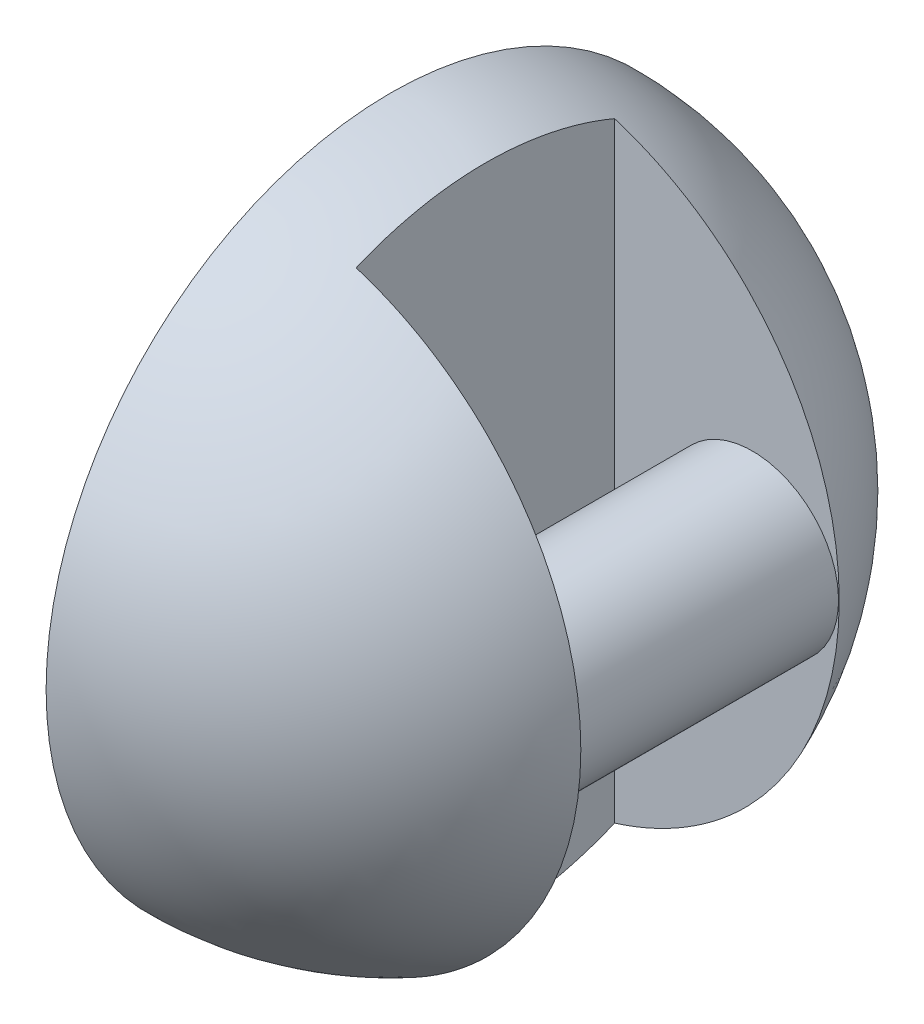
ISO-10303-21;
HEADER;
FILE_DESCRIPTION(('STEP AP214'),'2;1');
FILE_NAME('part.step','',(''),(''),'','','');
FILE_SCHEMA(('AUTOMOTIVE_DESIGN { 1 0 10303 214 1 1 1 1 }'));
ENDSEC;
DATA;
#1=APPLICATION_CONTEXT('core data for automotive mechanical design processes');
#2=APPLICATION_PROTOCOL_DEFINITION('international standard','automotive_design',2000,#1);
#3=PRODUCT_CONTEXT('',#1,'mechanical');
#4=PRODUCT('Part','Part','',(#3));
#5=PRODUCT_RELATED_PRODUCT_CATEGORY('part','',(#4));
#6=PRODUCT_DEFINITION_FORMATION('','',#4);
#7=PRODUCT_DEFINITION_CONTEXT('part definition',#1,'design');
#8=PRODUCT_DEFINITION('design','',#6,#7);
#9=PRODUCT_DEFINITION_SHAPE('','',#8);
#10=(LENGTH_UNIT() NAMED_UNIT(*) SI_UNIT(.MILLI.,.METRE.));
#11=(NAMED_UNIT(*) PLANE_ANGLE_UNIT() SI_UNIT($,.RADIAN.));
#12=(NAMED_UNIT(*) SI_UNIT($,.STERADIAN.) SOLID_ANGLE_UNIT());
#13=UNCERTAINTY_MEASURE_WITH_UNIT(LENGTH_MEASURE(1.E-05),#10,'distance_accuracy_value','');
#14=(GEOMETRIC_REPRESENTATION_CONTEXT(3) GLOBAL_UNCERTAINTY_ASSIGNED_CONTEXT((#13)) GLOBAL_UNIT_ASSIGNED_CONTEXT((#10,
#11,#12)) REPRESENTATION_CONTEXT('',''));
#15=CARTESIAN_POINT('',(0.,0.,0.));
#16=DIRECTION('',(0.,0.,1.));
#17=DIRECTION('',(1.,0.,0.));
#18=AXIS2_PLACEMENT_3D('',#15,#16,#17);
#19=CARTESIAN_POINT('',(0.,0.,0.));
#20=DIRECTION('',(0.,1.,0.));
#21=DIRECTION('',(1.,0.,0.));
#22=AXIS2_PLACEMENT_3D('',#19,#20,#21);
#23=SPHERICAL_SURFACE('',#22,20.);
#24=CARTESIAN_POINT('',(0.,0.,0.));
#25=DIRECTION('',(1.,0.,0.));
#26=DIRECTION('',(0.,0.,-1.));
#27=AXIS2_PLACEMENT_3D('',#24,#25,#26);
#28=CIRCLE('',#27,20.);
#29=CARTESIAN_POINT('',(0.,0.,-20.));
#30=VERTEX_POINT('',#29);
#31=EDGE_CURVE('E97',#30,#30,#28,.T.);
#32=ORIENTED_EDGE('',*,*,#31,.T.);
#33=EDGE_LOOP('',(#32));
#34=FACE_BOUND('',#33,.T.);
#35=CARTESIAN_POINT('',(5.5,0.,0.));
#36=DIRECTION('',(1.,0.,0.));
#37=DIRECTION('',(0.,0.,-1.));
#38=AXIS2_PLACEMENT_3D('',#35,#36,#37);
#39=CIRCLE('',#38,19.2288845230294);
#40=CARTESIAN_POINT('',(5.5,17.7059312096258,-7.5));
#41=VERTEX_POINT('',#40);
#42=CARTESIAN_POINT('',(5.5,17.7059312096258,7.5));
#43=VERTEX_POINT('',#42);
#44=EDGE_CURVE('E67',#41,#43,#39,.T.);
#45=ORIENTED_EDGE('',*,*,#44,.F.);
#46=CARTESIAN_POINT('',(0.,0.,-7.5));
#47=DIRECTION('',(0.,0.,-1.));
#48=DIRECTION('',(0.,1.,0.));
#49=AXIS2_PLACEMENT_3D('',#46,#47,#48);
#50=CIRCLE('',#49,18.5404962177392);
#51=CARTESIAN_POINT('',(5.5,-17.7059312096258,-7.5));
#52=VERTEX_POINT('',#51);
#53=EDGE_CURVE('E61',#41,#52,#50,.T.);
#54=ORIENTED_EDGE('',*,*,#53,.T.);
#55=CARTESIAN_POINT('',(5.5,-17.7059312096258,7.5));
#56=VERTEX_POINT('',#55);
#57=EDGE_CURVE('E75',#56,#52,#39,.T.);
#58=ORIENTED_EDGE('',*,*,#57,.F.);
#59=CARTESIAN_POINT('',(0.,0.,7.5));
#60=DIRECTION('',(0.,0.,1.));
#61=DIRECTION('',(0.,-1.,0.));
#62=AXIS2_PLACEMENT_3D('',#59,#60,#61);
#63=CIRCLE('',#62,18.5404962177392);
#64=EDGE_CURVE('E73',#56,#43,#63,.T.);
#65=ORIENTED_EDGE('',*,*,#64,.T.);
#66=EDGE_LOOP('',(#45,#54,#58,#65));
#67=FACE_BOUND('',#66,.T.);
#68=ADVANCED_FACE('F39',(#34,#67),#23,.T.);
#69=CARTESIAN_POINT('',(0.,0.,0.));
#70=DIRECTION('',(1.,0.,0.));
#71=DIRECTION('',(0.,0.,-1.));
#72=AXIS2_PLACEMENT_3D('',#69,#70,#71);
#73=PLANE('',#72);
#74=CARTESIAN_POINT('',(0.,0.,0.));
#75=DIRECTION('',(-1.,0.,0.));
#76=DIRECTION('',(0.,0.,1.));
#77=AXIS2_PLACEMENT_3D('',#74,#75,#76);
#78=CIRCLE('',#77,5.);
#79=CARTESIAN_POINT('',(0.,0.,5.));
#80=VERTEX_POINT('',#79);
#81=EDGE_CURVE('E104',#80,#80,#78,.T.);
#82=ORIENTED_EDGE('',*,*,#81,.F.);
#83=EDGE_LOOP('',(#82));
#84=FACE_BOUND('',#83,.T.);
#85=ORIENTED_EDGE('',*,*,#31,.F.);
#86=EDGE_LOOP('',(#85));
#87=FACE_BOUND('',#86,.T.);
#88=ADVANCED_FACE('F120',(#84,#87),#73,.F.);
#89=CARTESIAN_POINT('',(5.5,20.5,7.5));
#90=DIRECTION('',(0.,0.,1.));
#91=DIRECTION('',(0.,-1.,0.));
#92=AXIS2_PLACEMENT_3D('',#89,#90,#91);
#93=PLANE('',#92);
#94=CARTESIAN_POINT('',(13.5,0.,7.5));
#95=DIRECTION('',(0.,0.,1.));
#96=DIRECTION('',(0.,-1.,0.));
#97=AXIS2_PLACEMENT_3D('',#94,#95,#96);
#98=CIRCLE('',#97,5.);
#99=CARTESIAN_POINT('',(13.5,-5.,7.5));
#100=VERTEX_POINT('',#99);
#101=EDGE_CURVE('E11',#100,#100,#98,.F.);
#102=ORIENTED_EDGE('',*,*,#101,.F.);
#103=EDGE_LOOP('',(#102));
#104=FACE_BOUND('',#103,.T.);
#105=DIRECTION('',(0.,-1.,0.));
#106=VECTOR('',#105,1.);
#107=CARTESIAN_POINT('',(5.5,20.5,7.5));
#108=LINE('',#107,#106);
#109=EDGE_CURVE('E54',#43,#56,#108,.T.);
#110=ORIENTED_EDGE('',*,*,#109,.F.);
#111=ORIENTED_EDGE('',*,*,#64,.F.);
#112=EDGE_LOOP('',(#110,#111));
#113=FACE_BOUND('',#112,.T.);
#114=ADVANCED_FACE('F77',(#104,#113),#93,.F.);
#115=CARTESIAN_POINT('',(5.5,20.5,-7.5));
#116=DIRECTION('',(0.,0.,-1.));
#117=DIRECTION('',(0.,1.,0.));
#118=AXIS2_PLACEMENT_3D('',#115,#116,#117);
#119=PLANE('',#118);
#120=CARTESIAN_POINT('',(13.5,0.,-7.5));
#121=DIRECTION('',(0.,0.,-1.));
#122=DIRECTION('',(0.,1.,0.));
#123=AXIS2_PLACEMENT_3D('',#120,#121,#122);
#124=CIRCLE('',#123,5.);
#125=CARTESIAN_POINT('',(13.5,-5.,-7.5));
#126=VERTEX_POINT('',#125);
#127=EDGE_CURVE('E47',#126,#126,#124,.F.);
#128=ORIENTED_EDGE('',*,*,#127,.F.);
#129=EDGE_LOOP('',(#128));
#130=FACE_BOUND('',#129,.T.);
#131=DIRECTION('',(0.,1.,0.));
#132=VECTOR('',#131,1.);
#133=CARTESIAN_POINT('',(5.5,20.5,-7.5));
#134=LINE('',#133,#132);
#135=EDGE_CURVE('E69',#52,#41,#134,.T.);
#136=ORIENTED_EDGE('',*,*,#135,.F.);
#137=ORIENTED_EDGE('',*,*,#53,.F.);
#138=EDGE_LOOP('',(#136,#137));
#139=FACE_BOUND('',#138,.T.);
#140=ADVANCED_FACE('F93',(#130,#139),#119,.F.);
#141=CARTESIAN_POINT('',(5.5,0.,0.));
#142=DIRECTION('',(1.,0.,0.));
#143=DIRECTION('',(0.,0.,-1.));
#144=AXIS2_PLACEMENT_3D('',#141,#142,#143);
#145=PLANE('',#144);
#146=ORIENTED_EDGE('',*,*,#44,.T.);
#147=ORIENTED_EDGE('',*,*,#109,.T.);
#148=ORIENTED_EDGE('',*,*,#57,.T.);
#149=ORIENTED_EDGE('',*,*,#135,.T.);
#150=EDGE_LOOP('',(#146,#147,#148,#149));
#151=FACE_BOUND('',#150,.T.);
#152=ADVANCED_FACE('F68',(#151),#145,.T.);
#153=CARTESIAN_POINT('',(13.5,0.,-7.5));
#154=DIRECTION('',(0.,0.,1.));
#155=DIRECTION('',(0.,-1.,0.));
#156=AXIS2_PLACEMENT_3D('',#153,#154,#155);
#157=CYLINDRICAL_SURFACE('',#156,5.);
#158=CARTESIAN_POINT('',(13.5,-5.,-7.5));
#159=CARTESIAN_POINT('',(13.5,-5.,-7.34375));
#160=CARTESIAN_POINT('',(13.5,-5.,-7.1875));
#161=CARTESIAN_POINT('',(13.5,-5.,-6.875));
#162=CARTESIAN_POINT('',(13.5,-5.,-6.71875));
#163=CARTESIAN_POINT('',(13.5,-5.,-6.40625));
#164=CARTESIAN_POINT('',(13.5,-5.,-6.25));
#165=CARTESIAN_POINT('',(13.5,-5.,-5.9375));
#166=CARTESIAN_POINT('',(13.5,-5.,-5.78125));
#167=CARTESIAN_POINT('',(13.5,-5.,-5.46875));
#168=CARTESIAN_POINT('',(13.5,-5.,-5.3125));
#169=CARTESIAN_POINT('',(13.5,-5.,-5.));
#170=CARTESIAN_POINT('',(13.5,-5.,-4.84375));
#171=CARTESIAN_POINT('',(13.5,-5.,-4.53125));
#172=CARTESIAN_POINT('',(13.5,-5.,-4.375));
#173=CARTESIAN_POINT('',(13.5,-5.,-4.0625));
#174=CARTESIAN_POINT('',(13.5,-5.,-3.90625));
#175=CARTESIAN_POINT('',(13.5,-5.,-3.59375));
#176=CARTESIAN_POINT('',(13.5,-5.,-3.4375));
#177=CARTESIAN_POINT('',(13.5,-5.,-3.125));
#178=CARTESIAN_POINT('',(13.5,-5.,-2.96875));
#179=CARTESIAN_POINT('',(13.5,-5.,-2.65625));
#180=CARTESIAN_POINT('',(13.5,-5.,-2.5));
#181=CARTESIAN_POINT('',(13.5,-5.,-2.1875));
#182=CARTESIAN_POINT('',(13.5,-5.,-2.03125));
#183=CARTESIAN_POINT('',(13.5,-5.,-1.71875));
#184=CARTESIAN_POINT('',(13.5,-5.,-1.5625));
#185=CARTESIAN_POINT('',(13.5,-5.,-1.25));
#186=CARTESIAN_POINT('',(13.5,-5.,-1.09375));
#187=CARTESIAN_POINT('',(13.5,-5.,-0.781249999999998));
#188=CARTESIAN_POINT('',(13.5,-5.,-0.624999999999998));
#189=CARTESIAN_POINT('',(13.5,-5.,-0.312499999999999));
#190=CARTESIAN_POINT('',(13.5,-5.,-0.156249999999998));
#191=CARTESIAN_POINT('',(13.5,-5.,0.156250000000002));
#192=CARTESIAN_POINT('',(13.5,-5.,0.312500000000001));
#193=CARTESIAN_POINT('',(13.5,-5.,0.625000000000001));
#194=CARTESIAN_POINT('',(13.5,-5.,0.781250000000002));
#195=CARTESIAN_POINT('',(13.5,-5.,1.09375));
#196=CARTESIAN_POINT('',(13.5,-5.,1.25));
#197=CARTESIAN_POINT('',(13.5,-5.,1.5625));
#198=CARTESIAN_POINT('',(13.5,-5.,1.71875));
#199=CARTESIAN_POINT('',(13.5,-5.,2.03125));
#200=CARTESIAN_POINT('',(13.5,-5.,2.1875));
#201=CARTESIAN_POINT('',(13.5,-5.,2.5));
#202=CARTESIAN_POINT('',(13.5,-5.,2.65625));
#203=CARTESIAN_POINT('',(13.5,-5.,2.96875));
#204=CARTESIAN_POINT('',(13.5,-5.,3.125));
#205=CARTESIAN_POINT('',(13.5,-5.,3.4375));
#206=CARTESIAN_POINT('',(13.5,-5.,3.59375));
#207=CARTESIAN_POINT('',(13.5,-5.,3.90625));
#208=CARTESIAN_POINT('',(13.5,-5.,4.0625));
#209=CARTESIAN_POINT('',(13.5,-5.,4.375));
#210=CARTESIAN_POINT('',(13.5,-5.,4.53125));
#211=CARTESIAN_POINT('',(13.5,-5.,4.84375));
#212=CARTESIAN_POINT('',(13.5,-5.,5.));
#213=CARTESIAN_POINT('',(13.5,-5.,5.3125));
#214=CARTESIAN_POINT('',(13.5,-5.,5.46875));
#215=CARTESIAN_POINT('',(13.5,-5.,5.78125));
#216=CARTESIAN_POINT('',(13.5,-5.,5.9375));
#217=CARTESIAN_POINT('',(13.5,-5.,6.25));
#218=CARTESIAN_POINT('',(13.5,-5.,6.40625));
#219=CARTESIAN_POINT('',(13.5,-5.,6.71875));
#220=CARTESIAN_POINT('',(13.5,-5.,6.875));
#221=CARTESIAN_POINT('',(13.5,-5.,7.1875));
#222=CARTESIAN_POINT('',(13.5,-5.,7.34375));
#223=CARTESIAN_POINT('',(13.5,-5.,7.5));
#224=B_SPLINE_CURVE_WITH_KNOTS('',3,(#158,#159,#160,#161,#162,#163,#164,#165,#166,#167,#168,
#169,#170,#171,#172,#173,#174,#175,#176,#177,#178,#179,#180,#181,#182,#183,#184,#185,#186,#187,
#188,#189,#190,#191,#192,#193,#194,#195,#196,#197,#198,#199,#200,#201,#202,#203,#204,#205,#206,
#207,#208,#209,#210,#211,#212,#213,#214,#215,#216,#217,#218,#219,#220,#221,#222,#223),
.UNSPECIFIED.,.F.,.F.,(4,2,2,2,2,2,2,2,2,2,2,2,2,2,2,2,2,2,2,2,2,2,2,2,2,2,2,2,2,2,2,2,4),(0.,
0.46875,0.9375,1.40625,1.875,2.34375,2.8125,3.28125,3.75,4.21875,4.6875,5.15625,5.625,6.09375,
6.5625,7.03125,7.5,7.96875,8.4375,8.90625,9.375,9.84375,10.3125,10.78125,11.25,11.71875,12.1875,
12.65625,13.125,13.59375,14.0625,14.53125,15.),.UNSPECIFIED.);
#225=EDGE_CURVE('BSEAM90',#126,#100,#224,.T.);
#226=ORIENTED_EDGE('',*,*,#127,.T.);
#227=ORIENTED_EDGE('',*,*,#101,.T.);
#228=ORIENTED_EDGE('',*,*,#225,.T.);
#229=ORIENTED_EDGE('',*,*,#225,.F.);
#230=EDGE_LOOP('',(#226,#228,#227,#229));
#231=FACE_BOUND('',#230,.T.);
#232=ADVANCED_FACE('F90',(#231),#157,.T.);
#233=CARTESIAN_POINT('',(5.,0.,0.));
#234=DIRECTION('',(-1.,0.,0.));
#235=DIRECTION('',(0.,0.,1.));
#236=AXIS2_PLACEMENT_3D('',#233,#234,#235);
#237=CYLINDRICAL_SURFACE('',#236,5.);
#238=CARTESIAN_POINT('',(5.,0.,0.));
#239=DIRECTION('',(-1.,0.,0.));
#240=DIRECTION('',(0.,0.,1.));
#241=AXIS2_PLACEMENT_3D('',#238,#239,#240);
#242=CIRCLE('',#241,5.);
#243=CARTESIAN_POINT('',(5.,0.,5.));
#244=VERTEX_POINT('',#243);
#245=EDGE_CURVE('E80',#244,#244,#242,.T.);
#246=ORIENTED_EDGE('',*,*,#245,.F.);
#247=EDGE_LOOP('',(#246));
#248=FACE_BOUND('',#247,.T.);
#249=ORIENTED_EDGE('',*,*,#81,.T.);
#250=EDGE_LOOP('',(#249));
#251=FACE_BOUND('',#250,.T.);
#252=ADVANCED_FACE('F114',(#248,#251),#237,.F.);
#253=CARTESIAN_POINT('',(5.,0.,0.));
#254=DIRECTION('',(-1.,0.,0.));
#255=DIRECTION('',(0.,0.,1.));
#256=AXIS2_PLACEMENT_3D('',#253,#254,#255);
#257=PLANE('',#256);
#258=ORIENTED_EDGE('',*,*,#245,.T.);
#259=EDGE_LOOP('',(#258));
#260=FACE_BOUND('',#259,.T.);
#261=ADVANCED_FACE('F112',(#260),#257,.T.);
#262=CLOSED_SHELL('',(#68,#88,#114,#140,#152,#232,#252,#261));
#263=MANIFOLD_SOLID_BREP('B2',#262);
#264=ADVANCED_BREP_SHAPE_REPRESENTATION('',(#18,#263),#14);
#265=SHAPE_DEFINITION_REPRESENTATION(#9,#264);
ENDSEC;
END-ISO-10303-21;
